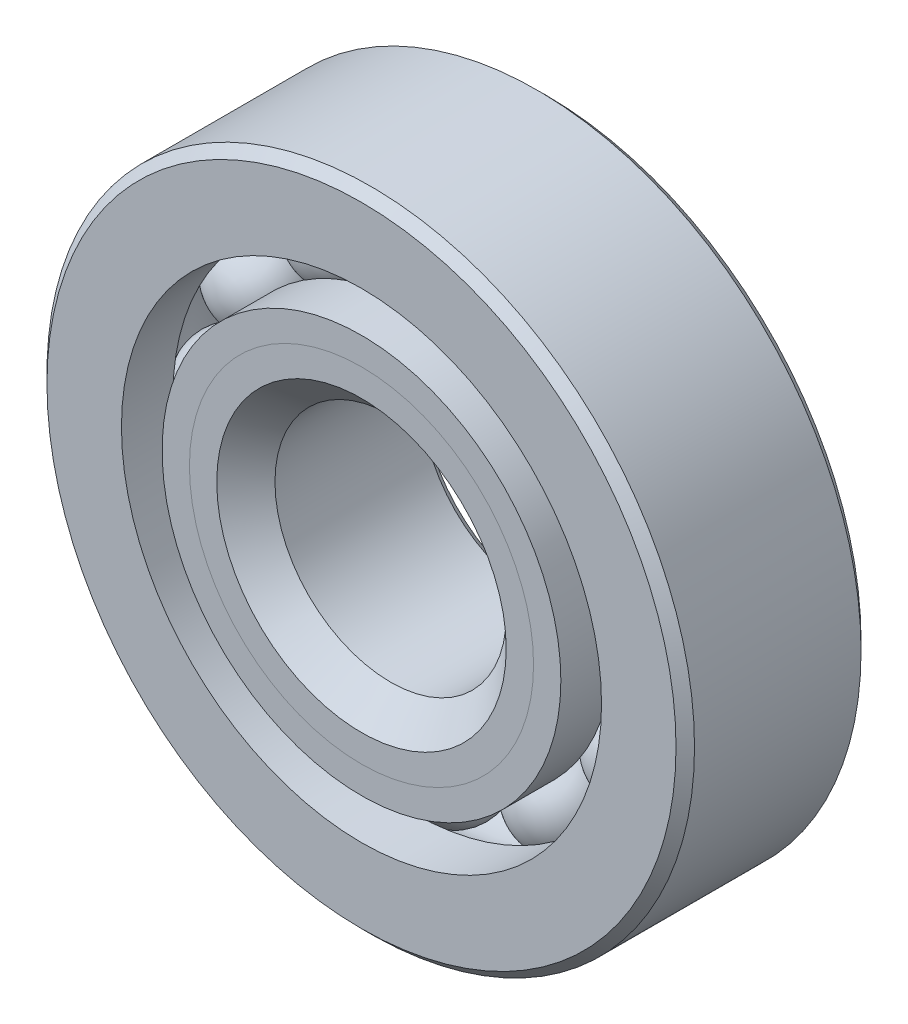
ISO-10303-21;
HEADER;
FILE_DESCRIPTION(('STEP AP214'),'2;1');
FILE_NAME('part.step','',(''),(''),'','','');
FILE_SCHEMA(('AUTOMOTIVE_DESIGN { 1 0 10303 214 1 1 1 1 }'));
ENDSEC;
DATA;
#1=APPLICATION_CONTEXT('core data for automotive mechanical design processes');
#2=APPLICATION_PROTOCOL_DEFINITION('international standard','automotive_design',2000,#1);
#3=PRODUCT_CONTEXT('',#1,'mechanical');
#4=PRODUCT('Part','Part','',(#3));
#5=PRODUCT_RELATED_PRODUCT_CATEGORY('part','',(#4));
#6=PRODUCT_DEFINITION_FORMATION('','',#4);
#7=PRODUCT_DEFINITION_CONTEXT('part definition',#1,'design');
#8=PRODUCT_DEFINITION('design','',#6,#7);
#9=PRODUCT_DEFINITION_SHAPE('','',#8);
#10=(LENGTH_UNIT() NAMED_UNIT(*) SI_UNIT(.MILLI.,.METRE.));
#11=(NAMED_UNIT(*) PLANE_ANGLE_UNIT() SI_UNIT($,.RADIAN.));
#12=(NAMED_UNIT(*) SI_UNIT($,.STERADIAN.) SOLID_ANGLE_UNIT());
#13=UNCERTAINTY_MEASURE_WITH_UNIT(LENGTH_MEASURE(1.E-05),#10,'distance_accuracy_value','');
#14=(GEOMETRIC_REPRESENTATION_CONTEXT(3) GLOBAL_UNCERTAINTY_ASSIGNED_CONTEXT((#13)) GLOBAL_UNIT_ASSIGNED_CONTEXT((#10,
#11,#12)) REPRESENTATION_CONTEXT('',''));
#15=CARTESIAN_POINT('',(0.,0.,0.));
#16=DIRECTION('',(0.,0.,1.));
#17=DIRECTION('',(1.,0.,0.));
#18=AXIS2_PLACEMENT_3D('',#15,#16,#17);
#19=CARTESIAN_POINT('',(-3.77031249999992,6.53037281041208,0.));
#20=DIRECTION('',(0.,0.,1.));
#21=DIRECTION('',(-0.499999999999989,0.866025403784445,0.));
#22=AXIS2_PLACEMENT_3D('',#19,#20,#21);
#23=SPHERICAL_SURFACE('',#22,1.57421805197336);
#24=CARTESIAN_POINT('',(-3.77031249999992,6.53037281041208,1.57421805197336));
#25=VERTEX_POINT('',#24);
#26=VERTEX_LOOP('',#25);
#27=FACE_BOUND('',#26,.T.);
#28=ADVANCED_FACE('F37',(#27),#23,.T.);
#29=CLOSED_SHELL('',(#28));
#30=MANIFOLD_SOLID_BREP('B2',#29);
#31=CARTESIAN_POINT('',(-6.53037281041199,3.77031250000008,0.));
#32=DIRECTION('',(0.,0.,1.));
#33=DIRECTION('',(-0.866025403784433,0.50000000000001,0.));
#34=AXIS2_PLACEMENT_3D('',#31,#32,#33);
#35=SPHERICAL_SURFACE('',#34,1.57421805197336);
#36=CARTESIAN_POINT('',(-6.53037281041199,3.77031250000008,1.57421805197336));
#37=VERTEX_POINT('',#36);
#38=VERTEX_LOOP('',#37);
#39=FACE_BOUND('',#38,.T.);
#40=ADVANCED_FACE('F68',(#39),#35,.T.);
#41=CLOSED_SHELL('',(#40));
#42=MANIFOLD_SOLID_BREP('B6',#41);
#43=CARTESIAN_POINT('',(-7.540625,0.,0.));
#44=DIRECTION('',(0.,0.,1.));
#45=DIRECTION('',(-1.,0.,0.));
#46=AXIS2_PLACEMENT_3D('',#43,#44,#45);
#47=SPHERICAL_SURFACE('',#46,1.57421805197336);
#48=CARTESIAN_POINT('',(-7.540625,0.,1.57421805197336));
#49=VERTEX_POINT('',#48);
#50=VERTEX_LOOP('',#49);
#51=FACE_BOUND('',#50,.T.);
#52=ADVANCED_FACE('F99',(#51),#47,.T.);
#53=CLOSED_SHELL('',(#52));
#54=MANIFOLD_SOLID_BREP('B33',#53);
#55=CARTESIAN_POINT('',(-6.53037281041207,-3.77031249999994,0.));
#56=DIRECTION('',(0.,0.,1.));
#57=DIRECTION('',(-0.866025403784443,-0.499999999999992,0.));
#58=AXIS2_PLACEMENT_3D('',#55,#56,#57);
#59=SPHERICAL_SURFACE('',#58,1.57421805197336);
#60=CARTESIAN_POINT('',(-6.53037281041207,-3.77031249999994,1.57421805197336));
#61=VERTEX_POINT('',#60);
#62=VERTEX_LOOP('',#61);
#63=FACE_BOUND('',#62,.T.);
#64=ADVANCED_FACE('F130',(#63),#59,.T.);
#65=CLOSED_SHELL('',(#64));
#66=MANIFOLD_SOLID_BREP('B64',#65);
#67=CARTESIAN_POINT('',(-3.77031250000005,-6.530372810412,0.));
#68=DIRECTION('',(0.,0.,1.));
#69=DIRECTION('',(-0.500000000000007,-0.866025403784435,0.));
#70=AXIS2_PLACEMENT_3D('',#67,#68,#69);
#71=SPHERICAL_SURFACE('',#70,1.57421805197336);
#72=CARTESIAN_POINT('',(-3.77031250000005,-6.530372810412,1.57421805197336));
#73=VERTEX_POINT('',#72);
#74=VERTEX_LOOP('',#73);
#75=FACE_BOUND('',#74,.T.);
#76=ADVANCED_FACE('F161',(#75),#71,.T.);
#77=CLOSED_SHELL('',(#76));
#78=MANIFOLD_SOLID_BREP('B95',#77);
#79=CARTESIAN_POINT('',(0.,-7.540625,0.));
#80=DIRECTION('',(0.,0.,1.));
#81=DIRECTION('',(0.,-1.,0.));
#82=AXIS2_PLACEMENT_3D('',#79,#80,#81);
#83=SPHERICAL_SURFACE('',#82,1.57421805197336);
#84=CARTESIAN_POINT('',(0.,-7.540625,1.57421805197336));
#85=VERTEX_POINT('',#84);
#86=VERTEX_LOOP('',#85);
#87=FACE_BOUND('',#86,.T.);
#88=ADVANCED_FACE('F192',(#87),#83,.T.);
#89=CLOSED_SHELL('',(#88));
#90=MANIFOLD_SOLID_BREP('B126',#89);
#91=CARTESIAN_POINT('',(3.77031249999996,-6.53037281041205,0.));
#92=DIRECTION('',(0.,0.,1.));
#93=DIRECTION('',(0.499999999999995,-0.866025403784442,0.));
#94=AXIS2_PLACEMENT_3D('',#91,#92,#93);
#95=SPHERICAL_SURFACE('',#94,1.57421805197336);
#96=CARTESIAN_POINT('',(3.77031249999996,-6.53037281041205,1.57421805197336));
#97=VERTEX_POINT('',#96);
#98=VERTEX_LOOP('',#97);
#99=FACE_BOUND('',#98,.T.);
#100=ADVANCED_FACE('F223',(#99),#95,.T.);
#101=CLOSED_SHELL('',(#100));
#102=MANIFOLD_SOLID_BREP('B157',#101);
#103=CARTESIAN_POINT('',(6.53037281041202,-3.77031250000003,0.));
#104=DIRECTION('',(0.,0.,1.));
#105=DIRECTION('',(0.866025403784436,-0.500000000000004,0.));
#106=AXIS2_PLACEMENT_3D('',#103,#104,#105);
#107=SPHERICAL_SURFACE('',#106,1.57421805197336);
#108=CARTESIAN_POINT('',(6.53037281041202,-3.77031250000003,1.57421805197336));
#109=VERTEX_POINT('',#108);
#110=VERTEX_LOOP('',#109);
#111=FACE_BOUND('',#110,.T.);
#112=ADVANCED_FACE('F254',(#111),#107,.T.);
#113=CLOSED_SHELL('',(#112));
#114=MANIFOLD_SOLID_BREP('B188',#113);
#115=CARTESIAN_POINT('',(7.540625,0.,0.));
#116=DIRECTION('',(0.,0.,1.));
#117=DIRECTION('',(1.,0.,0.));
#118=AXIS2_PLACEMENT_3D('',#115,#116,#117);
#119=SPHERICAL_SURFACE('',#118,1.57421805197336);
#120=CARTESIAN_POINT('',(7.540625,0.,1.57421805197336));
#121=VERTEX_POINT('',#120);
#122=VERTEX_LOOP('',#121);
#123=FACE_BOUND('',#122,.T.);
#124=ADVANCED_FACE('F285',(#123),#119,.T.);
#125=CLOSED_SHELL('',(#124));
#126=MANIFOLD_SOLID_BREP('B219',#125);
#127=CARTESIAN_POINT('',(6.53037281041204,3.77031249999998,0.));
#128=DIRECTION('',(0.,0.,1.));
#129=DIRECTION('',(0.86602540378444,0.499999999999998,0.));
#130=AXIS2_PLACEMENT_3D('',#127,#128,#129);
#131=SPHERICAL_SURFACE('',#130,1.57421805197336);
#132=CARTESIAN_POINT('',(6.53037281041204,3.77031249999998,1.57421805197336));
#133=VERTEX_POINT('',#132);
#134=VERTEX_LOOP('',#133);
#135=FACE_BOUND('',#134,.T.);
#136=ADVANCED_FACE('F316',(#135),#131,.T.);
#137=CLOSED_SHELL('',(#136));
#138=MANIFOLD_SOLID_BREP('B250',#137);
#139=CARTESIAN_POINT('',(3.77031250000001,6.53037281041203,0.));
#140=DIRECTION('',(0.,0.,1.));
#141=DIRECTION('',(0.500000000000001,0.866025403784438,0.));
#142=AXIS2_PLACEMENT_3D('',#139,#140,#141);
#143=SPHERICAL_SURFACE('',#142,1.57421805197336);
#144=CARTESIAN_POINT('',(3.77031250000001,6.53037281041203,1.57421805197336));
#145=VERTEX_POINT('',#144);
#146=VERTEX_LOOP('',#145);
#147=FACE_BOUND('',#146,.T.);
#148=ADVANCED_FACE('F347',(#147),#143,.T.);
#149=CLOSED_SHELL('',(#148));
#150=MANIFOLD_SOLID_BREP('B281',#149);
#151=CARTESIAN_POINT('',(0.,7.540625,0.));
#152=DIRECTION('',(0.,0.,1.));
#153=DIRECTION('',(0.,1.,0.));
#154=AXIS2_PLACEMENT_3D('',#151,#152,#153);
#155=SPHERICAL_SURFACE('',#154,1.57421805197336);
#156=CARTESIAN_POINT('',(0.,7.540625,1.57421805197336));
#157=VERTEX_POINT('',#156);
#158=VERTEX_LOOP('',#157);
#159=FACE_BOUND('',#158,.T.);
#160=ADVANCED_FACE('F380',(#159),#155,.T.);
#161=CLOSED_SHELL('',(#160));
#162=MANIFOLD_SOLID_BREP('B312',#161);
#163=CARTESIAN_POINT('',(0.,5.90520063810556,3.175));
#164=DIRECTION('',(0.,0.,-1.));
#165=DIRECTION('',(-1.,0.,0.));
#166=AXIS2_PLACEMENT_3D('',#163,#164,#165);
#167=PLANE('',#166);
#168=CARTESIAN_POINT('',(0.,0.,3.175));
#169=DIRECTION('',(0.,0.,1.));
#170=DIRECTION('',(1.,0.,0.));
#171=AXIS2_PLACEMENT_3D('',#168,#169,#170);
#172=CIRCLE('',#171,4.96757847401332);
#173=CARTESIAN_POINT('',(4.96757847401332,0.,3.175));
#174=VERTEX_POINT('',#173);
#175=EDGE_CURVE('E434',#174,#174,#172,.T.);
#176=ORIENTED_EDGE('',*,*,#175,.F.);
#177=EDGE_LOOP('',(#176));
#178=FACE_BOUND('',#177,.T.);
#179=CARTESIAN_POINT('',(0.,0.,3.175));
#180=DIRECTION('',(0.,0.,1.));
#181=DIRECTION('',(1.,0.,0.));
#182=AXIS2_PLACEMENT_3D('',#179,#180,#181);
#183=CIRCLE('',#182,5.90520063810556);
#184=CARTESIAN_POINT('',(5.90520063810556,0.,3.175));
#185=VERTEX_POINT('',#184);
#186=EDGE_CURVE('E379',#185,#185,#183,.T.);
#187=ORIENTED_EDGE('',*,*,#186,.T.);
#188=EDGE_LOOP('',(#187));
#189=FACE_BOUND('',#188,.T.);
#190=ADVANCED_FACE('F400',(#178,#189),#167,.F.);
#191=CARTESIAN_POINT('',(0.,0.,2.23737783590776));
#192=DIRECTION('',(0.,0.,1.));
#193=DIRECTION('',(1.,0.,0.));
#194=AXIS2_PLACEMENT_3D('',#191,#192,#193);
#195=CONICAL_SURFACE('',#194,4.96757847401332,0.78539816339745);
#196=ORIENTED_EDGE('',*,*,#186,.F.);
#197=EDGE_LOOP('',(#196));
#198=FACE_BOUND('',#197,.T.);
#199=CARTESIAN_POINT('',(0.,0.,2.23737783590776));
#200=DIRECTION('',(0.,0.,1.));
#201=DIRECTION('',(1.,0.,0.));
#202=AXIS2_PLACEMENT_3D('',#199,#200,#201);
#203=CIRCLE('',#202,4.96757847401332);
#204=CARTESIAN_POINT('',(4.96757847401332,0.,2.23737783590776));
#205=VERTEX_POINT('',#204);
#206=EDGE_CURVE('E406',#205,#205,#203,.T.);
#207=ORIENTED_EDGE('',*,*,#206,.T.);
#208=EDGE_LOOP('',(#207));
#209=FACE_BOUND('',#208,.T.);
#210=ADVANCED_FACE('F441',(#198,#209),#195,.T.);
#211=CARTESIAN_POINT('',(0.,0.,3.175));
#212=DIRECTION('',(0.,0.,1.));
#213=DIRECTION('',(1.,0.,0.));
#214=AXIS2_PLACEMENT_3D('',#211,#212,#213);
#215=CYLINDRICAL_SURFACE('',#214,4.96757847401332);
#216=ORIENTED_EDGE('',*,*,#206,.F.);
#217=EDGE_LOOP('',(#216));
#218=FACE_BOUND('',#217,.T.);
#219=CARTESIAN_POINT('',(0.,0.,0.));
#220=DIRECTION('',(0.,0.,1.));
#221=DIRECTION('',(1.,0.,0.));
#222=AXIS2_PLACEMENT_3D('',#219,#220,#221);
#223=CIRCLE('',#222,4.96757847401332);
#224=CARTESIAN_POINT('',(4.96757847401332,0.,0.));
#225=VERTEX_POINT('',#224);
#226=EDGE_CURVE('E410',#225,#225,#223,.T.);
#227=ORIENTED_EDGE('',*,*,#226,.T.);
#228=EDGE_LOOP('',(#227));
#229=FACE_BOUND('',#228,.T.);
#230=ADVANCED_FACE('F445',(#218,#229),#215,.T.);
#231=CARTESIAN_POINT('',(0.,4.96757847401332,0.));
#232=DIRECTION('',(0.,0.,-1.));
#233=DIRECTION('',(-1.,0.,0.));
#234=AXIS2_PLACEMENT_3D('',#231,#232,#233);
#235=PLANE('',#234);
#236=ORIENTED_EDGE('',*,*,#226,.F.);
#237=EDGE_LOOP('',(#236));
#238=FACE_BOUND('',#237,.T.);
#239=CARTESIAN_POINT('',(0.,0.,0.));
#240=DIRECTION('',(0.,0.,1.));
#241=DIRECTION('',(1.,0.,0.));
#242=AXIS2_PLACEMENT_3D('',#239,#240,#241);
#243=CIRCLE('',#242,5.96640694802664);
#244=CARTESIAN_POINT('',(5.96640694802664,0.,0.));
#245=VERTEX_POINT('',#244);
#246=EDGE_CURVE('E414',#245,#245,#243,.T.);
#247=ORIENTED_EDGE('',*,*,#246,.T.);
#248=EDGE_LOOP('',(#247));
#249=FACE_BOUND('',#248,.T.);
#250=ADVANCED_FACE('F450',(#238,#249),#235,.F.);
#251=CARTESIAN_POINT('',(0.,0.,0.));
#252=DIRECTION('',(0.,0.,1.));
#253=DIRECTION('',(1.,0.,0.));
#254=AXIS2_PLACEMENT_3D('',#251,#252,#253);
#255=TOROIDAL_SURFACE('',#254,7.540625,1.57421805197336);
#256=ORIENTED_EDGE('',*,*,#246,.F.);
#257=EDGE_LOOP('',(#256));
#258=FACE_BOUND('',#257,.T.);
#259=CARTESIAN_POINT('',(0.,0.,-1.41111111111111));
#260=DIRECTION('',(0.,0.,1.));
#261=DIRECTION('',(1.,0.,0.));
#262=AXIS2_PLACEMENT_3D('',#259,#260,#261);
#263=CIRCLE('',#262,6.8428228021978);
#264=CARTESIAN_POINT('',(6.8428228021978,0.,-1.41111111111111));
#265=VERTEX_POINT('',#264);
#266=EDGE_CURVE('E419',#265,#265,#263,.T.);
#267=ORIENTED_EDGE('',*,*,#266,.T.);
#268=EDGE_LOOP('',(#267));
#269=FACE_BOUND('',#268,.T.);
#270=ADVANCED_FACE('F456',(#258,#269),#255,.F.);
#271=CARTESIAN_POINT('',(0.,0.,3.175));
#272=DIRECTION('',(0.,0.,1.));
#273=DIRECTION('',(1.,0.,0.));
#274=AXIS2_PLACEMENT_3D('',#271,#272,#273);
#275=CYLINDRICAL_SURFACE('',#274,6.84282280219781);
#276=ORIENTED_EDGE('',*,*,#266,.F.);
#277=EDGE_LOOP('',(#276));
#278=FACE_BOUND('',#277,.T.);
#279=CARTESIAN_POINT('',(0.,0.,-3.17500000000001));
#280=DIRECTION('',(0.,0.,1.));
#281=DIRECTION('',(1.,0.,0.));
#282=AXIS2_PLACEMENT_3D('',#279,#280,#281);
#283=CIRCLE('',#282,6.84282280219781);
#284=CARTESIAN_POINT('',(6.84282280219781,0.,-3.17500000000001));
#285=VERTEX_POINT('',#284);
#286=EDGE_CURVE('E422',#285,#285,#283,.T.);
#287=ORIENTED_EDGE('',*,*,#286,.T.);
#288=EDGE_LOOP('',(#287));
#289=FACE_BOUND('',#288,.T.);
#290=ADVANCED_FACE('F460',(#278,#289),#275,.T.);
#291=CARTESIAN_POINT('',(0.,4.28625,-3.175));
#292=DIRECTION('',(0.,0.,1.));
#293=DIRECTION('',(1.,0.,0.));
#294=AXIS2_PLACEMENT_3D('',#291,#292,#293);
#295=PLANE('',#294);
#296=ORIENTED_EDGE('',*,*,#286,.F.);
#297=EDGE_LOOP('',(#296));
#298=FACE_BOUND('',#297,.T.);
#299=CARTESIAN_POINT('',(0.,0.,-3.175));
#300=DIRECTION('',(0.,0.,1.));
#301=DIRECTION('',(1.,0.,0.));
#302=AXIS2_PLACEMENT_3D('',#299,#300,#301);
#303=CIRCLE('',#302,4.28625);
#304=CARTESIAN_POINT('',(4.28625,0.,-3.175));
#305=VERTEX_POINT('',#304);
#306=EDGE_CURVE('E425',#305,#305,#303,.T.);
#307=ORIENTED_EDGE('',*,*,#306,.T.);
#308=EDGE_LOOP('',(#307));
#309=FACE_BOUND('',#308,.T.);
#310=ADVANCED_FACE('F464',(#298,#309),#295,.F.);
#311=CARTESIAN_POINT('',(0.,0.,-2.8575));
#312=DIRECTION('',(0.,0.,-1.));
#313=DIRECTION('',(-1.,0.,0.));
#314=AXIS2_PLACEMENT_3D('',#311,#312,#313);
#315=CONICAL_SURFACE('',#314,3.96875,0.785398163397444);
#316=ORIENTED_EDGE('',*,*,#306,.F.);
#317=EDGE_LOOP('',(#316));
#318=FACE_BOUND('',#317,.T.);
#319=CARTESIAN_POINT('',(0.,0.,-2.8575));
#320=DIRECTION('',(0.,0.,1.));
#321=DIRECTION('',(1.,0.,0.));
#322=AXIS2_PLACEMENT_3D('',#319,#320,#321);
#323=CIRCLE('',#322,3.96875);
#324=CARTESIAN_POINT('',(3.96875,0.,-2.8575));
#325=VERTEX_POINT('',#324);
#326=EDGE_CURVE('E428',#325,#325,#323,.T.);
#327=ORIENTED_EDGE('',*,*,#326,.T.);
#328=EDGE_LOOP('',(#327));
#329=FACE_BOUND('',#328,.T.);
#330=ADVANCED_FACE('F468',(#318,#329),#315,.F.);
#331=CARTESIAN_POINT('',(0.,0.,3.175));
#332=DIRECTION('',(0.,0.,1.));
#333=DIRECTION('',(1.,0.,0.));
#334=AXIS2_PLACEMENT_3D('',#331,#332,#333);
#335=CYLINDRICAL_SURFACE('',#334,3.96875);
#336=ORIENTED_EDGE('',*,*,#326,.F.);
#337=EDGE_LOOP('',(#336));
#338=FACE_BOUND('',#337,.T.);
#339=CARTESIAN_POINT('',(0.,0.,2.17617152598669));
#340=DIRECTION('',(0.,0.,1.));
#341=DIRECTION('',(1.,0.,0.));
#342=AXIS2_PLACEMENT_3D('',#339,#340,#341);
#343=CIRCLE('',#342,3.96875);
#344=CARTESIAN_POINT('',(3.96875,0.,2.17617152598669));
#345=VERTEX_POINT('',#344);
#346=EDGE_CURVE('E431',#345,#345,#343,.T.);
#347=ORIENTED_EDGE('',*,*,#346,.T.);
#348=EDGE_LOOP('',(#347));
#349=FACE_BOUND('',#348,.T.);
#350=ADVANCED_FACE('F472',(#338,#349),#335,.F.);
#351=CARTESIAN_POINT('',(0.,0.,3.175));
#352=DIRECTION('',(0.,0.,1.));
#353=DIRECTION('',(1.,0.,0.));
#354=AXIS2_PLACEMENT_3D('',#351,#352,#353);
#355=CONICAL_SURFACE('',#354,4.96757847401332,0.785398163397451);
#356=ORIENTED_EDGE('',*,*,#346,.F.);
#357=EDGE_LOOP('',(#356));
#358=FACE_BOUND('',#357,.T.);
#359=ORIENTED_EDGE('',*,*,#175,.T.);
#360=EDGE_LOOP('',(#359));
#361=FACE_BOUND('',#360,.T.);
#362=ADVANCED_FACE('F438',(#358,#361),#355,.F.);
#363=CLOSED_SHELL('',(#190,#210,#230,#250,#270,#290,#310,#330,#350,#362));
#364=MANIFOLD_SOLID_BREP('B343',#363);
#365=CARTESIAN_POINT('',(0.,6.8428228021978,3.175));
#366=DIRECTION('',(0.,0.,-1.));
#367=DIRECTION('',(-1.,0.,0.));
#368=AXIS2_PLACEMENT_3D('',#365,#366,#367);
#369=PLANE('',#368);
#370=CARTESIAN_POINT('',(0.,0.,3.175));
#371=DIRECTION('',(0.,0.,1.));
#372=DIRECTION('',(1.,0.,0.));
#373=AXIS2_PLACEMENT_3D('',#370,#371,#372);
#374=CIRCLE('',#373,5.90520063810556);
#375=CARTESIAN_POINT('',(5.90520063810556,0.,3.175));
#376=VERTEX_POINT('',#375);
#377=EDGE_CURVE('E399',#376,#376,#374,.T.);
#378=ORIENTED_EDGE('',*,*,#377,.F.);
#379=EDGE_LOOP('',(#378));
#380=FACE_BOUND('',#379,.T.);
#381=CARTESIAN_POINT('',(0.,0.,3.175));
#382=DIRECTION('',(0.,0.,1.));
#383=DIRECTION('',(1.,0.,0.));
#384=AXIS2_PLACEMENT_3D('',#381,#382,#383);
#385=CIRCLE('',#384,6.8428228021978);
#386=CARTESIAN_POINT('',(6.8428228021978,0.,3.175));
#387=VERTEX_POINT('',#386);
#388=EDGE_CURVE('E580',#387,#387,#385,.T.);
#389=ORIENTED_EDGE('',*,*,#388,.T.);
#390=EDGE_LOOP('',(#389));
#391=FACE_BOUND('',#390,.T.);
#392=ADVANCED_FACE('F558',(#380,#391),#369,.F.);
#393=CARTESIAN_POINT('',(0.,0.,3.175));
#394=DIRECTION('',(0.,0.,1.));
#395=DIRECTION('',(1.,0.,0.));
#396=AXIS2_PLACEMENT_3D('',#393,#394,#395);
#397=CONICAL_SURFACE('',#396,5.90520063810556,0.78539816339745);
#398=CARTESIAN_POINT('',(0.,0.,2.23737783590776));
#399=DIRECTION('',(0.,0.,1.));
#400=DIRECTION('',(1.,0.,0.));
#401=AXIS2_PLACEMENT_3D('',#398,#399,#400);
#402=CIRCLE('',#401,4.96757847401332);
#403=CARTESIAN_POINT('',(4.96757847401332,0.,2.23737783590776));
#404=VERTEX_POINT('',#403);
#405=EDGE_CURVE('E564',#404,#404,#402,.T.);
#406=ORIENTED_EDGE('',*,*,#405,.F.);
#407=EDGE_LOOP('',(#406));
#408=FACE_BOUND('',#407,.T.);
#409=ORIENTED_EDGE('',*,*,#377,.T.);
#410=EDGE_LOOP('',(#409));
#411=FACE_BOUND('',#410,.T.);
#412=ADVANCED_FACE('F605',(#408,#411),#397,.F.);
#413=CARTESIAN_POINT('',(0.,0.,3.175));
#414=DIRECTION('',(0.,0.,1.));
#415=DIRECTION('',(1.,0.,0.));
#416=AXIS2_PLACEMENT_3D('',#413,#414,#415);
#417=CYLINDRICAL_SURFACE('',#416,4.96757847401332);
#418=CARTESIAN_POINT('',(0.,0.,0.));
#419=DIRECTION('',(0.,0.,1.));
#420=DIRECTION('',(1.,0.,0.));
#421=AXIS2_PLACEMENT_3D('',#418,#419,#420);
#422=CIRCLE('',#421,4.96757847401332);
#423=CARTESIAN_POINT('',(4.96757847401332,0.,0.));
#424=VERTEX_POINT('',#423);
#425=EDGE_CURVE('E568',#424,#424,#422,.T.);
#426=ORIENTED_EDGE('',*,*,#425,.F.);
#427=EDGE_LOOP('',(#426));
#428=FACE_BOUND('',#427,.T.);
#429=ORIENTED_EDGE('',*,*,#405,.T.);
#430=EDGE_LOOP('',(#429));
#431=FACE_BOUND('',#430,.T.);
#432=ADVANCED_FACE('F600',(#428,#431),#417,.F.);
#433=CARTESIAN_POINT('',(0.,4.96757847401332,0.));
#434=DIRECTION('',(0.,0.,1.));
#435=DIRECTION('',(1.,0.,0.));
#436=AXIS2_PLACEMENT_3D('',#433,#434,#435);
#437=PLANE('',#436);
#438=CARTESIAN_POINT('',(0.,0.,0.));
#439=DIRECTION('',(0.,0.,1.));
#440=DIRECTION('',(1.,0.,0.));
#441=AXIS2_PLACEMENT_3D('',#438,#439,#440);
#442=CIRCLE('',#441,5.96640694802664);
#443=CARTESIAN_POINT('',(5.96640694802664,0.,0.));
#444=VERTEX_POINT('',#443);
#445=EDGE_CURVE('E572',#444,#444,#442,.T.);
#446=ORIENTED_EDGE('',*,*,#445,.F.);
#447=EDGE_LOOP('',(#446));
#448=FACE_BOUND('',#447,.T.);
#449=ORIENTED_EDGE('',*,*,#425,.T.);
#450=EDGE_LOOP('',(#449));
#451=FACE_BOUND('',#450,.T.);
#452=ADVANCED_FACE('F594',(#448,#451),#437,.F.);
#453=CARTESIAN_POINT('',(0.,0.,0.));
#454=DIRECTION('',(0.,0.,1.));
#455=DIRECTION('',(1.,0.,0.));
#456=AXIS2_PLACEMENT_3D('',#453,#454,#455);
#457=TOROIDAL_SURFACE('',#456,7.540625,1.57421805197336);
#458=CARTESIAN_POINT('',(0.,0.,1.41111111111111));
#459=DIRECTION('',(0.,0.,1.));
#460=DIRECTION('',(1.,0.,0.));
#461=AXIS2_PLACEMENT_3D('',#458,#459,#460);
#462=CIRCLE('',#461,6.8428228021978);
#463=CARTESIAN_POINT('',(6.8428228021978,0.,1.41111111111111));
#464=VERTEX_POINT('',#463);
#465=EDGE_CURVE('E577',#464,#464,#462,.T.);
#466=ORIENTED_EDGE('',*,*,#465,.F.);
#467=EDGE_LOOP('',(#466));
#468=FACE_BOUND('',#467,.T.);
#469=ORIENTED_EDGE('',*,*,#445,.T.);
#470=EDGE_LOOP('',(#469));
#471=FACE_BOUND('',#470,.T.);
#472=ADVANCED_FACE('F588',(#468,#471),#457,.F.);
#473=CARTESIAN_POINT('',(0.,0.,3.175));
#474=DIRECTION('',(0.,0.,1.));
#475=DIRECTION('',(1.,0.,0.));
#476=AXIS2_PLACEMENT_3D('',#473,#474,#475);
#477=CYLINDRICAL_SURFACE('',#476,6.8428228021978);
#478=ORIENTED_EDGE('',*,*,#388,.F.);
#479=EDGE_LOOP('',(#478));
#480=FACE_BOUND('',#479,.T.);
#481=ORIENTED_EDGE('',*,*,#465,.T.);
#482=EDGE_LOOP('',(#481));
#483=FACE_BOUND('',#482,.T.);
#484=ADVANCED_FACE('F585',(#480,#483),#477,.T.);
#485=CLOSED_SHELL('',(#392,#412,#432,#452,#472,#484));
#486=MANIFOLD_SOLID_BREP('B374',#485);
#487=CARTESIAN_POINT('',(0.,0.,2.8575));
#488=DIRECTION('',(0.,0.,-1.));
#489=DIRECTION('',(-1.,0.,0.));
#490=AXIS2_PLACEMENT_3D('',#487,#488,#489);
#491=CONICAL_SURFACE('',#490,11.1125,0.785398163397443);
#492=CARTESIAN_POINT('',(0.,0.,3.175));
#493=DIRECTION('',(0.,0.,1.));
#494=DIRECTION('',(1.,0.,0.));
#495=AXIS2_PLACEMENT_3D('',#492,#493,#494);
#496=CIRCLE('',#495,10.795);
#497=CARTESIAN_POINT('',(10.795,0.,3.175));
#498=VERTEX_POINT('',#497);
#499=EDGE_CURVE('E677',#498,#498,#496,.T.);
#500=ORIENTED_EDGE('',*,*,#499,.F.);
#501=EDGE_LOOP('',(#500));
#502=FACE_BOUND('',#501,.T.);
#503=CARTESIAN_POINT('',(0.,0.,2.8575));
#504=DIRECTION('',(0.,0.,1.));
#505=DIRECTION('',(1.,0.,0.));
#506=AXIS2_PLACEMENT_3D('',#503,#504,#505);
#507=CIRCLE('',#506,11.1125);
#508=CARTESIAN_POINT('',(11.1125,0.,2.8575));
#509=VERTEX_POINT('',#508);
#510=EDGE_CURVE('E557',#509,#509,#507,.T.);
#511=ORIENTED_EDGE('',*,*,#510,.T.);
#512=EDGE_LOOP('',(#511));
#513=FACE_BOUND('',#512,.T.);
#514=ADVANCED_FACE('F649',(#502,#513),#491,.T.);
#515=CARTESIAN_POINT('',(0.,0.,3.175));
#516=DIRECTION('',(0.,0.,1.));
#517=DIRECTION('',(1.,0.,0.));
#518=AXIS2_PLACEMENT_3D('',#515,#516,#517);
#519=CYLINDRICAL_SURFACE('',#518,11.1125);
#520=ORIENTED_EDGE('',*,*,#510,.F.);
#521=EDGE_LOOP('',(#520));
#522=FACE_BOUND('',#521,.T.);
#523=CARTESIAN_POINT('',(0.,0.,-2.8575));
#524=DIRECTION('',(0.,0.,1.));
#525=DIRECTION('',(1.,0.,0.));
#526=AXIS2_PLACEMENT_3D('',#523,#524,#525);
#527=CIRCLE('',#526,11.1125);
#528=CARTESIAN_POINT('',(11.1125,0.,-2.8575));
#529=VERTEX_POINT('',#528);
#530=EDGE_CURVE('E655',#529,#529,#527,.T.);
#531=ORIENTED_EDGE('',*,*,#530,.T.);
#532=EDGE_LOOP('',(#531));
#533=FACE_BOUND('',#532,.T.);
#534=ADVANCED_FACE('F684',(#522,#533),#519,.T.);
#535=CARTESIAN_POINT('',(0.,0.,-3.175));
#536=DIRECTION('',(0.,0.,1.));
#537=DIRECTION('',(1.,0.,0.));
#538=AXIS2_PLACEMENT_3D('',#535,#536,#537);
#539=CONICAL_SURFACE('',#538,10.795,0.785398163397443);
#540=ORIENTED_EDGE('',*,*,#530,.F.);
#541=EDGE_LOOP('',(#540));
#542=FACE_BOUND('',#541,.T.);
#543=CARTESIAN_POINT('',(0.,0.,-3.175));
#544=DIRECTION('',(0.,0.,1.));
#545=DIRECTION('',(1.,0.,0.));
#546=AXIS2_PLACEMENT_3D('',#543,#544,#545);
#547=CIRCLE('',#546,10.795);
#548=CARTESIAN_POINT('',(10.795,0.,-3.175));
#549=VERTEX_POINT('',#548);
#550=EDGE_CURVE('E659',#549,#549,#547,.T.);
#551=ORIENTED_EDGE('',*,*,#550,.T.);
#552=EDGE_LOOP('',(#551));
#553=FACE_BOUND('',#552,.T.);
#554=ADVANCED_FACE('F688',(#542,#553),#539,.T.);
#555=CARTESIAN_POINT('',(0.,10.795,-3.175));
#556=DIRECTION('',(0.,0.,1.));
#557=DIRECTION('',(1.,0.,0.));
#558=AXIS2_PLACEMENT_3D('',#555,#556,#557);
#559=PLANE('',#558);
#560=ORIENTED_EDGE('',*,*,#550,.F.);
#561=EDGE_LOOP('',(#560));
#562=FACE_BOUND('',#561,.T.);
#563=CARTESIAN_POINT('',(0.,0.,-3.175));
#564=DIRECTION('',(0.,0.,1.));
#565=DIRECTION('',(1.,0.,0.));
#566=AXIS2_PLACEMENT_3D('',#563,#564,#565);
#567=CIRCLE('',#566,8.23842719780219);
#568=CARTESIAN_POINT('',(8.23842719780219,0.,-3.175));
#569=VERTEX_POINT('',#568);
#570=EDGE_CURVE('E663',#569,#569,#567,.T.);
#571=ORIENTED_EDGE('',*,*,#570,.T.);
#572=EDGE_LOOP('',(#571));
#573=FACE_BOUND('',#572,.T.);
#574=ADVANCED_FACE('F693',(#562,#573),#559,.F.);
#575=CARTESIAN_POINT('',(0.,0.,3.175));
#576=DIRECTION('',(0.,0.,1.));
#577=DIRECTION('',(1.,0.,0.));
#578=AXIS2_PLACEMENT_3D('',#575,#576,#577);
#579=CYLINDRICAL_SURFACE('',#578,8.23842719780219);
#580=ORIENTED_EDGE('',*,*,#570,.F.);
#581=EDGE_LOOP('',(#580));
#582=FACE_BOUND('',#581,.T.);
#583=CARTESIAN_POINT('',(0.,0.,-1.41111111111111));
#584=DIRECTION('',(0.,0.,1.));
#585=DIRECTION('',(1.,0.,0.));
#586=AXIS2_PLACEMENT_3D('',#583,#584,#585);
#587=CIRCLE('',#586,8.23842719780219);
#588=CARTESIAN_POINT('',(8.23842719780219,0.,-1.41111111111111));
#589=VERTEX_POINT('',#588);
#590=EDGE_CURVE('E668',#589,#589,#587,.T.);
#591=ORIENTED_EDGE('',*,*,#590,.T.);
#592=EDGE_LOOP('',(#591));
#593=FACE_BOUND('',#592,.T.);
#594=ADVANCED_FACE('F699',(#582,#593),#579,.F.);
#595=CARTESIAN_POINT('',(0.,0.,0.));
#596=DIRECTION('',(0.,0.,1.));
#597=DIRECTION('',(1.,0.,0.));
#598=AXIS2_PLACEMENT_3D('',#595,#596,#597);
#599=TOROIDAL_SURFACE('',#598,7.540625,1.57421805197336);
#600=ORIENTED_EDGE('',*,*,#590,.F.);
#601=EDGE_LOOP('',(#600));
#602=FACE_BOUND('',#601,.T.);
#603=CARTESIAN_POINT('',(0.,0.,1.41111111111111));
#604=DIRECTION('',(0.,0.,1.));
#605=DIRECTION('',(1.,0.,0.));
#606=AXIS2_PLACEMENT_3D('',#603,#604,#605);
#607=CIRCLE('',#606,8.23842719780219);
#608=CARTESIAN_POINT('',(8.23842719780219,0.,1.41111111111111));
#609=VERTEX_POINT('',#608);
#610=EDGE_CURVE('E671',#609,#609,#607,.T.);
#611=ORIENTED_EDGE('',*,*,#610,.T.);
#612=EDGE_LOOP('',(#611));
#613=FACE_BOUND('',#612,.T.);
#614=ADVANCED_FACE('F703',(#602,#613),#599,.F.);
#615=CARTESIAN_POINT('',(0.,0.,3.175));
#616=DIRECTION('',(0.,0.,1.));
#617=DIRECTION('',(1.,0.,0.));
#618=AXIS2_PLACEMENT_3D('',#615,#616,#617);
#619=CYLINDRICAL_SURFACE('',#618,8.23842719780219);
#620=ORIENTED_EDGE('',*,*,#610,.F.);
#621=EDGE_LOOP('',(#620));
#622=FACE_BOUND('',#621,.T.);
#623=CARTESIAN_POINT('',(0.,0.,3.175));
#624=DIRECTION('',(0.,0.,1.));
#625=DIRECTION('',(1.,0.,0.));
#626=AXIS2_PLACEMENT_3D('',#623,#624,#625);
#627=CIRCLE('',#626,8.23842719780219);
#628=CARTESIAN_POINT('',(8.23842719780219,0.,3.175));
#629=VERTEX_POINT('',#628);
#630=EDGE_CURVE('E674',#629,#629,#627,.T.);
#631=ORIENTED_EDGE('',*,*,#630,.T.);
#632=EDGE_LOOP('',(#631));
#633=FACE_BOUND('',#632,.T.);
#634=ADVANCED_FACE('F707',(#622,#633),#619,.F.);
#635=CARTESIAN_POINT('',(0.,10.795,3.175));
#636=DIRECTION('',(0.,0.,-1.));
#637=DIRECTION('',(-1.,0.,0.));
#638=AXIS2_PLACEMENT_3D('',#635,#636,#637);
#639=PLANE('',#638);
#640=ORIENTED_EDGE('',*,*,#630,.F.);
#641=EDGE_LOOP('',(#640));
#642=FACE_BOUND('',#641,.T.);
#643=ORIENTED_EDGE('',*,*,#499,.T.);
#644=EDGE_LOOP('',(#643));
#645=FACE_BOUND('',#644,.T.);
#646=ADVANCED_FACE('F681',(#642,#645),#639,.F.);
#647=CLOSED_SHELL('',(#514,#534,#554,#574,#594,#614,#634,#646));
#648=MANIFOLD_SOLID_BREP('B394',#647);
#649=ADVANCED_BREP_SHAPE_REPRESENTATION('',(#18,#30,#42,#54,#66,#78,#90,#102,#114,#126,#138,
#150,#162,#364,#486,#648),#14);
#650=SHAPE_DEFINITION_REPRESENTATION(#9,#649);
ENDSEC;
END-ISO-10303-21;
